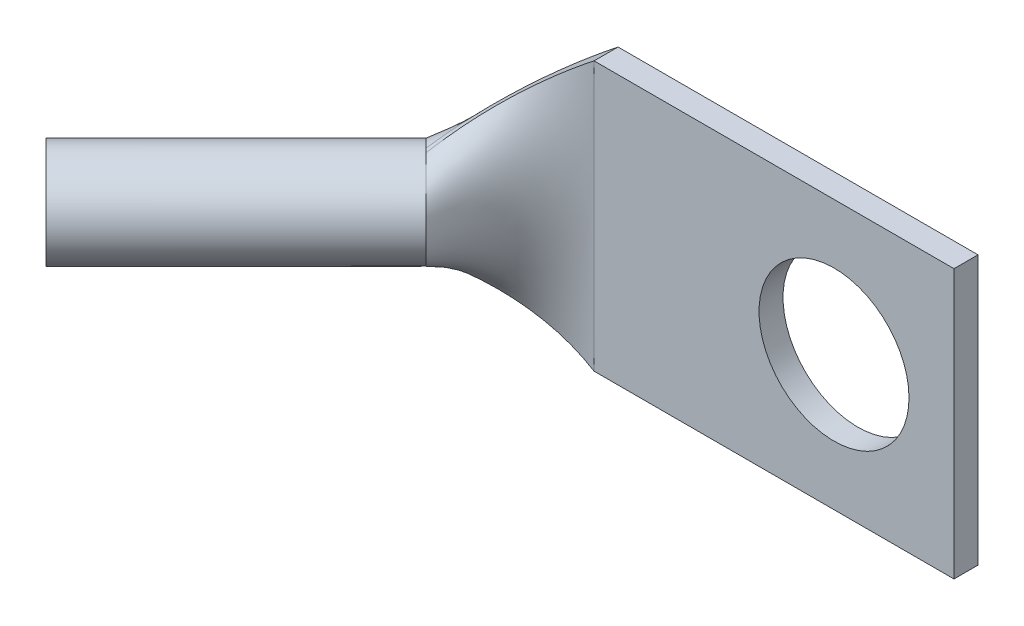
ISO-10303-21;
HEADER;
FILE_DESCRIPTION(('STEP AP214'),'2;1');
FILE_NAME('part.step','',(''),(''),'','','');
FILE_SCHEMA(('AUTOMOTIVE_DESIGN { 1 0 10303 214 1 1 1 1 }'));
ENDSEC;
DATA;
#1=APPLICATION_CONTEXT('core data for automotive mechanical design processes');
#2=APPLICATION_PROTOCOL_DEFINITION('international standard','automotive_design',2000,#1);
#3=PRODUCT_CONTEXT('',#1,'mechanical');
#4=PRODUCT('Part','Part','',(#3));
#5=PRODUCT_RELATED_PRODUCT_CATEGORY('part','',(#4));
#6=PRODUCT_DEFINITION_FORMATION('','',#4);
#7=PRODUCT_DEFINITION_CONTEXT('part definition',#1,'design');
#8=PRODUCT_DEFINITION('design','',#6,#7);
#9=PRODUCT_DEFINITION_SHAPE('','',#8);
#10=(LENGTH_UNIT() NAMED_UNIT(*) SI_UNIT(.MILLI.,.METRE.));
#11=(NAMED_UNIT(*) PLANE_ANGLE_UNIT() SI_UNIT($,.RADIAN.));
#12=(NAMED_UNIT(*) SI_UNIT($,.STERADIAN.) SOLID_ANGLE_UNIT());
#13=UNCERTAINTY_MEASURE_WITH_UNIT(LENGTH_MEASURE(1.E-05),#10,'distance_accuracy_value','');
#14=(GEOMETRIC_REPRESENTATION_CONTEXT(3) GLOBAL_UNCERTAINTY_ASSIGNED_CONTEXT((#13)) GLOBAL_UNIT_ASSIGNED_CONTEXT((#10,
#11,#12)) REPRESENTATION_CONTEXT('',''));
#15=CARTESIAN_POINT('',(0.,0.,0.));
#16=DIRECTION('',(0.,0.,1.));
#17=DIRECTION('',(1.,0.,0.));
#18=AXIS2_PLACEMENT_3D('',#15,#16,#17);
#19=CARTESIAN_POINT('',(-10.0578868555975,0.,10.0578868555975));
#20=DIRECTION('',(-0.707106781186547,0.,0.707106781186548));
#21=DIRECTION('',(0.707106781186548,0.,0.707106781186547));
#22=AXIS2_PLACEMENT_3D('',#19,#20,#21);
#23=PLANE('',#22);
#24=CARTESIAN_POINT('',(-10.0578868555975,0.,10.0578868555975));
#25=DIRECTION('',(-0.707106781186547,0.,0.707106781186548));
#26=DIRECTION('',(0.707106781186548,0.,0.707106781186547));
#27=AXIS2_PLACEMENT_3D('',#24,#25,#26);
#28=CIRCLE('',#27,2.4003);
#29=CARTESIAN_POINT('',(-8.36061844871538,0.,11.7551552624795));
#30=VERTEX_POINT('',#29);
#31=EDGE_CURVE('E140',#30,#30,#28,.T.);
#32=ORIENTED_EDGE('',*,*,#31,.T.);
#33=EDGE_LOOP('',(#32));
#34=FACE_BOUND('',#33,.T.);
#35=CARTESIAN_POINT('',(-10.0578868555975,0.,10.0578868555975));
#36=DIRECTION('',(-0.707106781186547,0.,0.707106781186548));
#37=DIRECTION('',(0.707106781186548,0.,0.707106781186547));
#38=AXIS2_PLACEMENT_3D('',#35,#36,#37);
#39=CIRCLE('',#38,1.6383);
#40=CARTESIAN_POINT('',(-8.89943381597953,0.,11.2163398952154));
#41=VERTEX_POINT('',#40);
#42=EDGE_CURVE('E217',#41,#41,#39,.T.);
#43=ORIENTED_EDGE('',*,*,#42,.F.);
#44=EDGE_LOOP('',(#43));
#45=FACE_BOUND('',#44,.T.);
#46=ADVANCED_FACE('F130',(#34,#45),#23,.T.);
#47=CARTESIAN_POINT('',(-10.0578868555975,0.,10.0578868555975));
#48=DIRECTION('',(0.707106781186547,0.,-0.707106781186548));
#49=DIRECTION('',(-0.707106781186548,0.,-0.707106781186547));
#50=AXIS2_PLACEMENT_3D('',#47,#48,#49);
#51=CYLINDRICAL_SURFACE('',#50,2.4003);
#52=ORIENTED_EDGE('',*,*,#31,.F.);
#53=EDGE_LOOP('',(#52));
#54=FACE_BOUND('',#53,.T.);
#55=CARTESIAN_POINT('',(-0.0856158656463956,2.39724423809908,-0.0856158656463956));
#56=CARTESIAN_POINT('',(-0.0678056900921732,2.39851639349581,-0.0678056900921731));
#57=CARTESIAN_POINT('',(-0.0321569828959637,2.40026672765528,-0.0321569828959637));
#58=CARTESIAN_POINT('',(0.0213480250002032,2.40050765508822,0.0213480250002032));
#59=CARTESIAN_POINT('',(0.0748318246908102,2.39836379705286,0.0748318246908102));
#60=CARTESIAN_POINT('',(0.110438129194003,2.39534610282651,0.110438129194003));
#61=CARTESIAN_POINT('',(0.128220048066058,2.39344089723308,0.128220048066058));
#62=B_SPLINE_CURVE_WITH_KNOTS('',3,(#55,#56,#57,#58,#59,#60,#61),.UNSPECIFIED.,.F.,.F.,(4,1,1,1,
4),(0.235738241616343,0.243369508765289,0.251000775914235,0.258632043063181,0.266263310212127),.UNSPECIFIED.);
#63=CARTESIAN_POINT('',(0.128225030543083,2.39353770867189,0.128225030543081));
#64=VERTEX_POINT('',#63);
#65=CARTESIAN_POINT('',(-0.0856170735877792,2.39727973056196,-0.0856170735877809));
#66=VERTEX_POINT('',#65);
#67=EDGE_CURVE('E207',#64,#66,#62,.F.);
#68=ORIENTED_EDGE('',*,*,#67,.T.);
#69=CARTESIAN_POINT('',(0.,0.,0.));
#70=DIRECTION('',(0.707106781186547,0.,-0.707106781186548));
#71=DIRECTION('',(0.707106781186548,0.,0.707106781186547));
#72=AXIS2_PLACEMENT_3D('',#69,#70,#71);
#73=CIRCLE('',#72,2.4003);
#74=CARTESIAN_POINT('',(-1.69726840688207,0.,-1.69726840688207));
#75=VERTEX_POINT('',#74);
#76=EDGE_CURVE('E190',#75,#66,#73,.T.);
#77=ORIENTED_EDGE('',*,*,#76,.F.);
#78=CARTESIAN_POINT('',(0.,0.,0.));
#79=DIRECTION('',(0.707106781186547,0.,-0.707106781186548));
#80=DIRECTION('',(0.707106781186548,0.,0.707106781186547));
#81=AXIS2_PLACEMENT_3D('',#78,#79,#80);
#82=CIRCLE('',#81,2.4003);
#83=CARTESIAN_POINT('',(-0.0856176831280756,-2.39729799351699,-0.085617683128079));
#84=VERTEX_POINT('',#83);
#85=EDGE_CURVE('E178',#84,#75,#82,.T.);
#86=ORIENTED_EDGE('',*,*,#85,.F.);
#87=CARTESIAN_POINT('',(0.,0.,0.));
#88=DIRECTION('',(0.707106781186547,0.,-0.707106781186548));
#89=DIRECTION('',(0.707106781186548,0.,0.707106781186547));
#90=AXIS2_PLACEMENT_3D('',#87,#88,#89);
#91=CIRCLE('',#90,2.4003);
#92=CARTESIAN_POINT('',(0.128223948791534,-2.39351661458043,0.128223948791532));
#93=VERTEX_POINT('',#92);
#94=EDGE_CURVE('E168',#93,#84,#91,.T.);
#95=ORIENTED_EDGE('',*,*,#94,.F.);
#96=CARTESIAN_POINT('',(0.,0.,0.));
#97=DIRECTION('',(-0.707106781186547,0.,0.707106781186548));
#98=DIRECTION('',(0.707106781186548,0.,0.707106781186547));
#99=AXIS2_PLACEMENT_3D('',#96,#97,#98);
#100=CIRCLE('',#99,2.4003);
#101=EDGE_CURVE('E200',#64,#93,#100,.F.);
#102=ORIENTED_EDGE('',*,*,#101,.F.);
#103=EDGE_LOOP('',(#68,#77,#86,#95,#102));
#104=FACE_BOUND('',#103,.T.);
#105=ADVANCED_FACE('F132',(#54,#104),#51,.T.);
#106=CARTESIAN_POINT('',(-10.0578868555975,0.,10.0578868555975));
#107=DIRECTION('',(0.707106781186547,0.,-0.707106781186548));
#108=DIRECTION('',(-0.707106781186548,0.,-0.707106781186547));
#109=AXIS2_PLACEMENT_3D('',#106,#107,#108);
#110=CYLINDRICAL_SURFACE('',#109,1.6383);
#111=CARTESIAN_POINT('',(-0.898025612106914,0.,0.898025612106916));
#112=DIRECTION('',(-0.707106781186547,0.,0.707106781186548));
#113=DIRECTION('',(0.707106781186548,0.,0.707106781186547));
#114=AXIS2_PLACEMENT_3D('',#111,#112,#113);
#115=CIRCLE('',#114,1.6383);
#116=CARTESIAN_POINT('',(0.260427427511007,0.,2.05647865172484));
#117=VERTEX_POINT('',#116);
#118=EDGE_CURVE('E13',#117,#117,#115,.T.);
#119=ORIENTED_EDGE('',*,*,#118,.F.);
#120=EDGE_LOOP('',(#119));
#121=FACE_BOUND('',#120,.T.);
#122=ORIENTED_EDGE('',*,*,#42,.T.);
#123=EDGE_LOOP('',(#122));
#124=FACE_BOUND('',#123,.T.);
#125=ADVANCED_FACE('F510',(#121,#124),#110,.F.);
#126=CARTESIAN_POINT('',(-0.898025612106915,0.,0.898025612106916));
#127=DIRECTION('',(-0.707106781186547,0.,0.707106781186548));
#128=DIRECTION('',(0.707106781186548,0.,0.707106781186547));
#129=AXIS2_PLACEMENT_3D('',#126,#127,#128);
#130=PLANE('',#129);
#131=ORIENTED_EDGE('',*,*,#118,.T.);
#132=EDGE_LOOP('',(#131));
#133=FACE_BOUND('',#132,.T.);
#134=ADVANCED_FACE('F516',(#133),#130,.T.);
#135=CARTESIAN_POINT('',(-0.0856158656463964,-2.39724423809908,-0.0856158656463964));
#136=CARTESIAN_POINT('',(0.979057117819121,-3.96882949206605,-2.75249603339793));
#137=CARTESIAN_POINT('',(2.95235050300656,-5.54041474603303,-4.54278248625477));
#138=CARTESIAN_POINT('',(5.08,-7.112,-5.08));
#139=CARTESIAN_POINT('',(-0.291524054424608,-2.38253651032921,-0.291524054424608));
#140=CARTESIAN_POINT('',(0.84178499196698,-3.75288358223842,-2.88976815925007));
#141=CARTESIAN_POINT('',(2.88371444008048,-5.12323065414763,-4.61141854918084));
#142=CARTESIAN_POINT('',(5.08,-6.49357772605684,-5.08));
#143=CARTESIAN_POINT('',(-0.708127054574494,-2.24488382370541,-0.708127054574494));
#144=CARTESIAN_POINT('',(0.564049658533723,-3.25805793213934,-3.16750349268333));
#145=CARTESIAN_POINT('',(2.74484677336386,-4.27123204057326,-4.75028621589748));
#146=CARTESIAN_POINT('',(5.08,-5.28440614900718,-5.08));
#147=CARTESIAN_POINT('',(-1.25001698929095,-1.71146269681553,-1.25001698929095));
#148=CARTESIAN_POINT('',(0.202789702056086,-2.3131398477975,-3.52876344916096));
#149=CARTESIAN_POINT('',(2.56421679512504,-2.91481699877946,-4.93091619413629));
#150=CARTESIAN_POINT('',(5.08,-3.51649414976143,-5.08));
#151=CARTESIAN_POINT('',(-1.61419068475015,-0.919150779493687,-1.61419068475015));
#152=CARTESIAN_POINT('',(-0.0399927615833843,-1.20136343462941,-3.77154591280044));
#153=CARTESIAN_POINT('',(2.4428255633053,-1.48357608976513,-5.05230742595603));
#154=CARTESIAN_POINT('',(5.08,-1.76578874490084,-5.08));
#155=CARTESIAN_POINT('',(-1.69726840688207,-0.304104322580167,-1.69726840688207));
#156=CARTESIAN_POINT('',(-0.0953779096713275,-0.400291770609001,-3.82693106088838));
#157=CARTESIAN_POINT('',(2.41513298926133,-0.496479218637834,-5.08));
#158=CARTESIAN_POINT('',(5.08,-0.592666666666667,-5.08));
#159=CARTESIAN_POINT('',(-1.69726840688207,0.,-1.69726840688207));
#160=CARTESIAN_POINT('',(-0.0953779096713276,0.,-3.82693106088838));
#161=CARTESIAN_POINT('',(2.41513298926133,0.,-5.08));
#162=CARTESIAN_POINT('',(5.08,0.,-5.08));
#163=B_SPLINE_SURFACE_WITH_KNOTS('',3,3,((#135,#136,#137,#138),(#139,#140,#141,#142),(#143,#144,
#145,#146),(#147,#148,#149,#150),(#151,#152,#153,#154),(#155,#156,#157,#158),(#159,#160,#161,
#162)),.UNSPECIFIED.,.F.,.F.,.F.,(4,1,1,1,4),(4,4),(0.764261758383657,0.823196318787742,
0.882130879191828,0.941065439595914,1.),(0.,1.),.UNSPECIFIED.);
#164=CARTESIAN_POINT('',(-1.69726840688207,0.,-1.69726840688207));
#165=CARTESIAN_POINT('',(-0.0953779096713276,0.,-3.82693106088838));
#166=CARTESIAN_POINT('',(2.41513298926133,0.,-5.08));
#167=CARTESIAN_POINT('',(5.08,0.,-5.08));
#168=B_SPLINE_CURVE_WITH_KNOTS('',3,(#164,#165,#166,#167),.UNSPECIFIED.,.F.,.F.,(4,4),(0.,1.),.UNSPECIFIED.);
#169=CARTESIAN_POINT('',(5.08,0.,-5.08));
#170=VERTEX_POINT('',#169);
#171=EDGE_CURVE('E196',#75,#170,#168,.T.);
#172=DIRECTION('',(0.,1.,0.));
#173=VECTOR('',#172,1.);
#174=CARTESIAN_POINT('',(5.08,-7.112,-5.08));
#175=LINE('',#174,#173);
#176=CARTESIAN_POINT('',(5.08,-7.112,-5.08));
#177=VERTEX_POINT('',#176);
#178=EDGE_CURVE('E463',#177,#170,#175,.T.);
#179=CARTESIAN_POINT('',(-0.0856158656463964,-2.39724423809908,-0.0856158656463964));
#180=CARTESIAN_POINT('',(0.979057117819121,-3.96882949206605,-2.75249603339793));
#181=CARTESIAN_POINT('',(2.95235050300656,-5.54041474603303,-4.54278248625477));
#182=CARTESIAN_POINT('',(5.08,-7.112,-5.08));
#183=B_SPLINE_CURVE_WITH_KNOTS('',3,(#179,#180,#181,#182),.UNSPECIFIED.,.F.,.F.,(4,4),(0.,1.),.UNSPECIFIED.);
#184=EDGE_CURVE('E289',#84,#177,#183,.T.);
#185=ORIENTED_EDGE('',*,*,#85,.T.);
#186=ORIENTED_EDGE('',*,*,#171,.T.);
#187=ORIENTED_EDGE('',*,*,#178,.F.);
#188=ORIENTED_EDGE('',*,*,#184,.F.);
#189=EDGE_LOOP('',(#185,#186,#187,#188));
#190=FACE_BOUND('',#189,.T.);
#191=ADVANCED_FACE('F265',(#190),#163,.T.);
#192=CARTESIAN_POINT('',(0.128220048066058,-2.39344089723308,0.128220048066058));
#193=CARTESIAN_POINT('',(1.12161439362742,-3.96629393148872,-2.18660542425629));
#194=CARTESIAN_POINT('',(3.02362914091071,-5.53914696574436,-3.62483718168395));
#195=CARTESIAN_POINT('',(5.08,-7.112,-3.81));
#196=CARTESIAN_POINT('',(0.110438129194003,-2.39534610282651,0.110438129194003));
#197=CARTESIAN_POINT('',(1.10975978104605,-3.96756406855101,-2.23373781461544));
#198=CARTESIAN_POINT('',(3.01770183462002,-5.5397820342755,-3.7013200435302));
#199=CARTESIAN_POINT('',(5.08,-7.112,-3.91583333333333));
#200=CARTESIAN_POINT('',(0.0748318246908103,-2.39836379705286,0.0748318246908103));
#201=CARTESIAN_POINT('',(1.0860222447106,-3.96957586470191,-2.32803090650646));
#202=CARTESIAN_POINT('',(3.0058330664523,-5.54078793235095,-3.85429992280904));
#203=CARTESIAN_POINT('',(5.08000000000001,-7.11199999999999,-4.1275));
#204=CARTESIAN_POINT('',(0.0213480250002031,-2.40050765508823,0.021348025000203));
#205=CARTESIAN_POINT('',(1.05036637825018,-3.97100510339215,-2.4695201063002));
#206=CARTESIAN_POINT('',(2.98800513322208,-5.54150255169608,-4.0837945227059));
#207=CARTESIAN_POINT('',(5.07999999999999,-7.11200000000001,-4.445));
#208=CARTESIAN_POINT('',(-0.032156982895964,-2.40026672765528,-0.032156982895964));
#209=CARTESIAN_POINT('',(1.01469637298608,-3.97084448510352,-2.61102344489764));
#210=CARTESIAN_POINT('',(2.97017013059004,-5.54142224255176,-4.31329619200463));
#211=CARTESIAN_POINT('',(5.08000000000001,-7.112,-4.7625));
#212=CARTESIAN_POINT('',(-0.0678056900921737,-2.39851639349581,-0.0678056900921737));
#213=CARTESIAN_POINT('',(0.990930568188603,-3.96967759566387,-2.70534480525067));
#214=CARTESIAN_POINT('',(2.9582872281913,-5.54083879783194,-4.46629020551448));
#215=CARTESIAN_POINT('',(5.08,-7.112,-4.97416666666667));
#216=CARTESIAN_POINT('',(-0.0856158656463964,-2.39724423809908,-0.0856158656463964));
#217=CARTESIAN_POINT('',(0.979057117819121,-3.96882949206605,-2.75249603339793));
#218=CARTESIAN_POINT('',(2.95235050300656,-5.54041474603303,-4.54278248625477));
#219=CARTESIAN_POINT('',(5.08,-7.112,-5.08));
#220=B_SPLINE_SURFACE_WITH_KNOTS('',3,3,((#192,#193,#194,#195),(#196,#197,#198,#199),(#200,#201,
#202,#203),(#204,#205,#206,#207),(#208,#209,#210,#211),(#212,#213,#214,#215),(#216,#217,#218,
#219)),.UNSPECIFIED.,.F.,.F.,.F.,(4,1,1,1,4),(4,4),(0.733736689787873,0.741367956936819,
0.748999224085765,0.756630491234711,0.764261758383657),(0.,1.),.UNSPECIFIED.);
#221=DIRECTION('',(0.,0.,-1.));
#222=VECTOR('',#221,1.);
#223=CARTESIAN_POINT('',(5.08,-7.112,-5.08));
#224=LINE('',#223,#222);
#225=CARTESIAN_POINT('',(5.08,-7.112,-3.81));
#226=VERTEX_POINT('',#225);
#227=EDGE_CURVE('E201',#226,#177,#224,.T.);
#228=CARTESIAN_POINT('',(0.128220048066058,-2.39344089723308,0.128220048066058));
#229=CARTESIAN_POINT('',(1.12161439362742,-3.96629393148872,-2.18660542425629));
#230=CARTESIAN_POINT('',(3.02362914091071,-5.53914696574436,-3.62483718168395));
#231=CARTESIAN_POINT('',(5.08,-7.112,-3.81));
#232=B_SPLINE_CURVE_WITH_KNOTS('',3,(#228,#229,#230,#231),.UNSPECIFIED.,.F.,.F.,(4,4),(0.,1.),.UNSPECIFIED.);
#233=EDGE_CURVE('E148',#93,#226,#232,.T.);
#234=ORIENTED_EDGE('',*,*,#94,.T.);
#235=ORIENTED_EDGE('',*,*,#184,.T.);
#236=ORIENTED_EDGE('',*,*,#227,.F.);
#237=ORIENTED_EDGE('',*,*,#233,.F.);
#238=EDGE_LOOP('',(#234,#235,#236,#237));
#239=FACE_BOUND('',#238,.T.);
#240=ADVANCED_FACE('F252',(#239),#220,.T.);
#241=CARTESIAN_POINT('',(0.128220048066058,2.39344089723308,0.128220048066058));
#242=CARTESIAN_POINT('',(1.12161439362742,3.96629393148872,-2.18660542425629));
#243=CARTESIAN_POINT('',(3.02362914091071,5.53914696574436,-3.62483718168395));
#244=CARTESIAN_POINT('',(5.08,7.112,-3.81));
#245=CARTESIAN_POINT('',(0.339092451547004,2.37084742543155,0.339092451547004));
#246=CARTESIAN_POINT('',(1.26219599594805,3.75367606139881,-2.04602382193566));
#247=CARTESIAN_POINT('',(3.09391994207102,5.13650469736607,-3.55454638052364));
#248=CARTESIAN_POINT('',(5.08,6.51933333333333,-3.81));
#249=CARTESIAN_POINT('',(0.754732902327056,2.21301722501273,0.754732902327055));
#250=CARTESIAN_POINT('',(1.53928962980142,3.25334481667515,-1.7689301880823));
#251=CARTESIAN_POINT('',(3.23246675899771,4.29367240833758,-3.41599956359696));
#252=CARTESIAN_POINT('',(5.08,5.334,-3.81));
#253=CARTESIAN_POINT('',(1.27404356876115,1.67033177946393,1.27404356876116));
#254=CARTESIAN_POINT('',(1.88549674075749,2.29888785297595,-1.42272307712623));
#255=CARTESIAN_POINT('',(3.40557031447574,2.92744392648798,-3.24289600811892));
#256=CARTESIAN_POINT('',(5.08,3.556,-3.81));
#257=CARTESIAN_POINT('',(1.61733689746755,0.897145645963959,1.61733689746754));
#258=CARTESIAN_POINT('',(2.11435895989508,1.19076376397597,-1.19386085798864));
#259=CARTESIAN_POINT('',(3.52000142404454,1.48438188198798,-3.12846489855013));
#260=CARTESIAN_POINT('',(5.08,1.778,-3.81));
#261=CARTESIAN_POINT('',(1.73730713695146,0.,1.73730713695146));
#262=CARTESIAN_POINT('',(2.19433911955102,0.,-1.11388069833269));
#263=CARTESIAN_POINT('',(3.55999150387251,0.,-3.08847481872215));
#264=CARTESIAN_POINT('',(5.08,0.,-3.81));
#265=CARTESIAN_POINT('',(1.61733689746754,-0.897145645963958,1.61733689746754));
#266=CARTESIAN_POINT('',(2.11435895989508,-1.19076376397597,-1.19386085798864));
#267=CARTESIAN_POINT('',(3.52000142404453,-1.48438188198799,-3.12846489855013));
#268=CARTESIAN_POINT('',(5.08,-1.778,-3.81));
#269=CARTESIAN_POINT('',(1.27404356876116,-1.67033177946393,1.27404356876116));
#270=CARTESIAN_POINT('',(1.88549674075749,-2.29888785297596,-1.42272307712623));
#271=CARTESIAN_POINT('',(3.40557031447574,-2.92744392648798,-3.24289600811892));
#272=CARTESIAN_POINT('',(5.08,-3.556,-3.81));
#273=CARTESIAN_POINT('',(0.754732902327054,-2.21301722501273,0.754732902327053));
#274=CARTESIAN_POINT('',(1.53928962980142,-3.25334481667515,-1.7689301880823));
#275=CARTESIAN_POINT('',(3.23246675899771,-4.29367240833758,-3.41599956359696));
#276=CARTESIAN_POINT('',(5.08,-5.334,-3.81));
#277=CARTESIAN_POINT('',(0.339092451547004,-2.37084742543155,0.339092451547004));
#278=CARTESIAN_POINT('',(1.26219599594805,-3.75367606139881,-2.04602382193566));
#279=CARTESIAN_POINT('',(3.09391994207102,-5.13650469736607,-3.55454638052364));
#280=CARTESIAN_POINT('',(5.08,-6.51933333333334,-3.81));
#281=CARTESIAN_POINT('',(0.128220048066058,-2.39344089723308,0.128220048066058));
#282=CARTESIAN_POINT('',(1.12161439362742,-3.96629393148872,-2.18660542425629));
#283=CARTESIAN_POINT('',(3.02362914091071,-5.53914696574436,-3.62483718168395));
#284=CARTESIAN_POINT('',(5.08,-7.112,-3.81));
#285=B_SPLINE_SURFACE_WITH_KNOTS('',3,3,((#241,#242,#243,#244),(#245,#246,#247,#248),(#249,#250,
#251,#252),(#253,#254,#255,#256),(#257,#258,#259,#260),(#261,#262,#263,#264),(#265,#266,#267,
#268),(#269,#270,#271,#272),(#273,#274,#275,#276),(#277,#278,#279,#280),(#281,#282,#283,#284)),
.UNSPECIFIED.,.F.,.F.,.F.,(4,1,1,1,1,1,1,1,4),(4,4),(0.266263310212127,0.324697482659095,
0.383131655106063,0.441565827553032,0.5,0.558434172446968,0.616868344893937,0.675302517340905,
0.733736689787873),(0.,1.),.UNSPECIFIED.);
#286=DIRECTION('',(0.,-1.,0.));
#287=VECTOR('',#286,1.);
#288=CARTESIAN_POINT('',(5.08,-7.112,-3.81));
#289=LINE('',#288,#287);
#290=CARTESIAN_POINT('',(5.08,7.112,-3.81));
#291=VERTEX_POINT('',#290);
#292=EDGE_CURVE('E156',#291,#226,#289,.T.);
#293=CARTESIAN_POINT('',(0.128220048066058,2.39344089723308,0.128220048066058));
#294=CARTESIAN_POINT('',(1.12161439362742,3.96629393148872,-2.18660542425629));
#295=CARTESIAN_POINT('',(3.02362914091071,5.53914696574436,-3.62483718168395));
#296=CARTESIAN_POINT('',(5.08,7.112,-3.81));
#297=B_SPLINE_CURVE_WITH_KNOTS('',3,(#293,#294,#295,#296),.UNSPECIFIED.,.F.,.F.,(4,4),(0.,1.),.UNSPECIFIED.);
#298=EDGE_CURVE('E212',#64,#291,#297,.T.);
#299=ORIENTED_EDGE('',*,*,#101,.T.);
#300=ORIENTED_EDGE('',*,*,#233,.T.);
#301=ORIENTED_EDGE('',*,*,#292,.F.);
#302=ORIENTED_EDGE('',*,*,#298,.F.);
#303=EDGE_LOOP('',(#299,#300,#301,#302));
#304=FACE_BOUND('',#303,.T.);
#305=ADVANCED_FACE('F264',(#304),#285,.T.);
#306=CARTESIAN_POINT('',(-0.0856158656463956,2.39724423809908,-0.0856158656463956));
#307=CARTESIAN_POINT('',(0.979057117819122,3.96882949206605,-2.75249603339793));
#308=CARTESIAN_POINT('',(2.95235050300656,5.54041474603303,-4.54278248625477));
#309=CARTESIAN_POINT('',(5.08,7.112,-5.08));
#310=CARTESIAN_POINT('',(-0.0678056900921732,2.39851639349581,-0.0678056900921731));
#311=CARTESIAN_POINT('',(0.990930568188603,3.96967759566387,-2.70534480525067));
#312=CARTESIAN_POINT('',(2.9582872281913,5.54083879783194,-4.46629020551447));
#313=CARTESIAN_POINT('',(5.08,7.112,-4.97416666666667));
#314=CARTESIAN_POINT('',(-0.0321569828959637,2.40026672765528,-0.0321569828959637));
#315=CARTESIAN_POINT('',(1.01469637298608,3.97084448510352,-2.61102344489764));
#316=CARTESIAN_POINT('',(2.97017013059003,5.54142224255175,-4.31329619200462));
#317=CARTESIAN_POINT('',(5.08,7.11199999999999,-4.76249999999999));
#318=CARTESIAN_POINT('',(0.0213480250002032,2.40050765508822,0.0213480250002032));
#319=CARTESIAN_POINT('',(1.05036637825019,3.97100510339215,-2.4695201063002));
#320=CARTESIAN_POINT('',(2.98800513322209,5.54150255169609,-4.08379452270591));
#321=CARTESIAN_POINT('',(5.08,7.11200000000002,-4.445));
#322=CARTESIAN_POINT('',(0.0748318246908102,2.39836379705286,0.0748318246908102));
#323=CARTESIAN_POINT('',(1.08602224471059,3.96957586470191,-2.32803090650646));
#324=CARTESIAN_POINT('',(3.00583306645229,5.54078793235095,-3.85429992280904));
#325=CARTESIAN_POINT('',(5.08,7.11199999999999,-4.1275));
#326=CARTESIAN_POINT('',(0.110438129194003,2.39534610282651,0.110438129194003));
#327=CARTESIAN_POINT('',(1.10975978104605,3.96756406855101,-2.23373781461544));
#328=CARTESIAN_POINT('',(3.01770183462002,5.5397820342755,-3.70132004353019));
#329=CARTESIAN_POINT('',(5.08,7.112,-3.91583333333333));
#330=CARTESIAN_POINT('',(0.128220048066058,2.39344089723308,0.128220048066058));
#331=CARTESIAN_POINT('',(1.12161439362742,3.96629393148872,-2.18660542425629));
#332=CARTESIAN_POINT('',(3.02362914091071,5.53914696574436,-3.62483718168395));
#333=CARTESIAN_POINT('',(5.08,7.112,-3.81));
#334=B_SPLINE_SURFACE_WITH_KNOTS('',3,3,((#306,#307,#308,#309),(#310,#311,#312,#313),(#314,#315,
#316,#317),(#318,#319,#320,#321),(#322,#323,#324,#325),(#326,#327,#328,#329),(#330,#331,#332,
#333)),.UNSPECIFIED.,.F.,.F.,.F.,(4,1,1,1,4),(4,4),(0.235738241616343,0.243369508765289,
0.251000775914235,0.258632043063181,0.266263310212127),(0.,1.),.UNSPECIFIED.);
#335=DIRECTION('',(0.,0.,1.));
#336=VECTOR('',#335,1.);
#337=CARTESIAN_POINT('',(5.08,7.112,-5.08));
#338=LINE('',#337,#336);
#339=CARTESIAN_POINT('',(5.08,7.112,-5.08));
#340=VERTEX_POINT('',#339);
#341=EDGE_CURVE('E210',#340,#291,#338,.T.);
#342=CARTESIAN_POINT('',(-0.0856158656463956,2.39724423809908,-0.0856158656463956));
#343=CARTESIAN_POINT('',(0.979057117819122,3.96882949206605,-2.75249603339793));
#344=CARTESIAN_POINT('',(2.95235050300656,5.54041474603303,-4.54278248625477));
#345=CARTESIAN_POINT('',(5.08,7.112,-5.08));
#346=B_SPLINE_CURVE_WITH_KNOTS('',3,(#342,#343,#344,#345),.UNSPECIFIED.,.F.,.F.,(4,4),(0.,1.),.UNSPECIFIED.);
#347=EDGE_CURVE('E194',#66,#340,#346,.T.);
#348=ORIENTED_EDGE('',*,*,#67,.F.);
#349=ORIENTED_EDGE('',*,*,#298,.T.);
#350=ORIENTED_EDGE('',*,*,#341,.F.);
#351=ORIENTED_EDGE('',*,*,#347,.F.);
#352=EDGE_LOOP('',(#348,#349,#350,#351));
#353=FACE_BOUND('',#352,.T.);
#354=ADVANCED_FACE('F206',(#353),#334,.T.);
#355=CARTESIAN_POINT('',(-1.69726840688207,0.,-1.69726840688207));
#356=CARTESIAN_POINT('',(-0.0953779096713276,0.,-3.82693106088838));
#357=CARTESIAN_POINT('',(2.41513298926133,0.,-5.08));
#358=CARTESIAN_POINT('',(5.08,0.,-5.08));
#359=CARTESIAN_POINT('',(-1.69726840688207,0.304104322580168,-1.69726840688207));
#360=CARTESIAN_POINT('',(-0.0953779096713278,0.400291770609,-3.82693106088838));
#361=CARTESIAN_POINT('',(2.41513298926133,0.496479218637833,-5.08));
#362=CARTESIAN_POINT('',(5.08,0.592666666666667,-5.08));
#363=CARTESIAN_POINT('',(-1.61419068475015,0.919150779493688,-1.61419068475015));
#364=CARTESIAN_POINT('',(-0.0399927615833876,1.20136343462941,-3.77154591280043));
#365=CARTESIAN_POINT('',(2.4428255633053,1.48357608976512,-5.05230742595602));
#366=CARTESIAN_POINT('',(5.07999999999999,1.76578874490084,-5.07999999999999));
#367=CARTESIAN_POINT('',(-1.25001698929095,1.71146269681553,-1.25001698929095));
#368=CARTESIAN_POINT('',(0.202789702056089,2.3131398477975,-3.52876344916097));
#369=CARTESIAN_POINT('',(2.56421679512504,2.91481699877946,-4.93091619413629));
#370=CARTESIAN_POINT('',(5.08000000000001,3.51649414976143,-5.08));
#371=CARTESIAN_POINT('',(-0.708127054574493,2.24488382370541,-0.708127054574493));
#372=CARTESIAN_POINT('',(0.564049658533721,3.25805793213933,-3.16750349268333));
#373=CARTESIAN_POINT('',(2.74484677336385,4.27123204057326,-4.75028621589747));
#374=CARTESIAN_POINT('',(5.07999999999999,5.28440614900718,-5.07999999999999));
#375=CARTESIAN_POINT('',(-0.291524054424607,2.38253651032921,-0.291524054424607));
#376=CARTESIAN_POINT('',(0.841784991966981,3.75288358223842,-2.88976815925007));
#377=CARTESIAN_POINT('',(2.88371444008048,5.12323065414763,-4.61141854918084));
#378=CARTESIAN_POINT('',(5.08,6.49357772605684,-5.08));
#379=CARTESIAN_POINT('',(-0.0856158656463956,2.39724423809908,-0.0856158656463956));
#380=CARTESIAN_POINT('',(0.979057117819122,3.96882949206605,-2.75249603339793));
#381=CARTESIAN_POINT('',(2.95235050300656,5.54041474603303,-4.54278248625477));
#382=CARTESIAN_POINT('',(5.08,7.112,-5.08));
#383=B_SPLINE_SURFACE_WITH_KNOTS('',3,3,((#355,#356,#357,#358),(#359,#360,#361,#362),(#363,#364,
#365,#366),(#367,#368,#369,#370),(#371,#372,#373,#374),(#375,#376,#377,#378),(#379,#380,#381,
#382)),.UNSPECIFIED.,.F.,.F.,.F.,(4,1,1,1,4),(4,4),(0.,0.0589345604040858,0.117869120808172,
0.176803681212257,0.235738241616343),(0.,1.),.UNSPECIFIED.);
#384=EDGE_CURVE('E466',#170,#340,#175,.T.);
#385=ORIENTED_EDGE('',*,*,#76,.T.);
#386=ORIENTED_EDGE('',*,*,#347,.T.);
#387=ORIENTED_EDGE('',*,*,#384,.F.);
#388=ORIENTED_EDGE('',*,*,#171,.F.);
#389=EDGE_LOOP('',(#385,#386,#387,#388));
#390=FACE_BOUND('',#389,.T.);
#391=ADVANCED_FACE('F193',(#390),#383,.T.);
#392=CARTESIAN_POINT('',(24.13,-7.112,-5.08));
#393=DIRECTION('',(0.,0.,1.));
#394=DIRECTION('',(1.,0.,0.));
#395=AXIS2_PLACEMENT_3D('',#392,#393,#394);
#396=PLANE('',#395);
#397=CARTESIAN_POINT('',(17.78,0.,-5.08));
#398=DIRECTION('',(0.,0.,1.));
#399=DIRECTION('',(1.,0.,0.));
#400=AXIS2_PLACEMENT_3D('',#397,#398,#399);
#401=CIRCLE('',#400,3.96875);
#402=CARTESIAN_POINT('',(21.74875,0.,-5.08));
#403=VERTEX_POINT('',#402);
#404=EDGE_CURVE('E135',#403,#403,#401,.T.);
#405=ORIENTED_EDGE('',*,*,#404,.T.);
#406=EDGE_LOOP('',(#405));
#407=FACE_BOUND('',#406,.T.);
#408=ORIENTED_EDGE('',*,*,#178,.T.);
#409=ORIENTED_EDGE('',*,*,#384,.T.);
#410=DIRECTION('',(-1.,0.,0.));
#411=VECTOR('',#410,1.);
#412=CARTESIAN_POINT('',(24.13,7.112,-5.08));
#413=LINE('',#412,#411);
#414=CARTESIAN_POINT('',(24.13,7.112,-5.08));
#415=VERTEX_POINT('',#414);
#416=EDGE_CURVE('E388',#415,#340,#413,.T.);
#417=ORIENTED_EDGE('',*,*,#416,.F.);
#418=DIRECTION('',(0.,1.,0.));
#419=VECTOR('',#418,1.);
#420=CARTESIAN_POINT('',(24.13,-7.112,-5.08));
#421=LINE('',#420,#419);
#422=CARTESIAN_POINT('',(24.13,-7.112,-5.08));
#423=VERTEX_POINT('',#422);
#424=EDGE_CURVE('E489',#423,#415,#421,.T.);
#425=ORIENTED_EDGE('',*,*,#424,.F.);
#426=DIRECTION('',(-1.,0.,0.));
#427=VECTOR('',#426,1.);
#428=CARTESIAN_POINT('',(24.13,-7.112,-5.08));
#429=LINE('',#428,#427);
#430=EDGE_CURVE('E434',#423,#177,#429,.T.);
#431=ORIENTED_EDGE('',*,*,#430,.T.);
#432=EDGE_LOOP('',(#408,#409,#417,#425,#431));
#433=FACE_BOUND('',#432,.T.);
#434=ADVANCED_FACE('F351',(#407,#433),#396,.F.);
#435=CARTESIAN_POINT('',(24.13,7.112,-5.08));
#436=DIRECTION('',(0.,-1.,0.));
#437=DIRECTION('',(0.,0.,-1.));
#438=AXIS2_PLACEMENT_3D('',#435,#436,#437);
#439=PLANE('',#438);
#440=ORIENTED_EDGE('',*,*,#341,.T.);
#441=DIRECTION('',(-1.,0.,0.));
#442=VECTOR('',#441,1.);
#443=CARTESIAN_POINT('',(24.13,7.112,-3.81));
#444=LINE('',#443,#442);
#445=CARTESIAN_POINT('',(24.13,7.112,-3.81));
#446=VERTEX_POINT('',#445);
#447=EDGE_CURVE('E385',#446,#291,#444,.T.);
#448=ORIENTED_EDGE('',*,*,#447,.F.);
#449=DIRECTION('',(0.,0.,1.));
#450=VECTOR('',#449,1.);
#451=CARTESIAN_POINT('',(24.13,7.112,-5.08));
#452=LINE('',#451,#450);
#453=EDGE_CURVE('E456',#415,#446,#452,.T.);
#454=ORIENTED_EDGE('',*,*,#453,.F.);
#455=ORIENTED_EDGE('',*,*,#416,.T.);
#456=EDGE_LOOP('',(#440,#448,#454,#455));
#457=FACE_BOUND('',#456,.T.);
#458=ADVANCED_FACE('F400',(#457),#439,.F.);
#459=CARTESIAN_POINT('',(24.13,-7.112,-3.81));
#460=DIRECTION('',(0.,0.,-1.));
#461=DIRECTION('',(0.,1.,0.));
#462=AXIS2_PLACEMENT_3D('',#459,#460,#461);
#463=PLANE('',#462);
#464=CARTESIAN_POINT('',(17.78,0.,-3.81));
#465=DIRECTION('',(0.,0.,1.));
#466=DIRECTION('',(1.,0.,0.));
#467=AXIS2_PLACEMENT_3D('',#464,#465,#466);
#468=CIRCLE('',#467,3.96875);
#469=CARTESIAN_POINT('',(21.74875,0.,-3.81));
#470=VERTEX_POINT('',#469);
#471=EDGE_CURVE('E492',#470,#470,#468,.T.);
#472=ORIENTED_EDGE('',*,*,#471,.F.);
#473=EDGE_LOOP('',(#472));
#474=FACE_BOUND('',#473,.T.);
#475=ORIENTED_EDGE('',*,*,#292,.T.);
#476=DIRECTION('',(-1.,0.,0.));
#477=VECTOR('',#476,1.);
#478=CARTESIAN_POINT('',(24.13,-7.112,-3.81));
#479=LINE('',#478,#477);
#480=CARTESIAN_POINT('',(24.13,-7.112,-3.81));
#481=VERTEX_POINT('',#480);
#482=EDGE_CURVE('E389',#481,#226,#479,.T.);
#483=ORIENTED_EDGE('',*,*,#482,.F.);
#484=DIRECTION('',(0.,-1.,0.));
#485=VECTOR('',#484,1.);
#486=CARTESIAN_POINT('',(24.13,-7.112,-3.81));
#487=LINE('',#486,#485);
#488=EDGE_CURVE('E453',#446,#481,#487,.T.);
#489=ORIENTED_EDGE('',*,*,#488,.F.);
#490=ORIENTED_EDGE('',*,*,#447,.T.);
#491=EDGE_LOOP('',(#475,#483,#489,#490));
#492=FACE_BOUND('',#491,.T.);
#493=ADVANCED_FACE('F408',(#474,#492),#463,.F.);
#494=CARTESIAN_POINT('',(24.13,-7.112,-5.08));
#495=DIRECTION('',(0.,1.,0.));
#496=DIRECTION('',(0.,0.,1.));
#497=AXIS2_PLACEMENT_3D('',#494,#495,#496);
#498=PLANE('',#497);
#499=ORIENTED_EDGE('',*,*,#227,.T.);
#500=ORIENTED_EDGE('',*,*,#430,.F.);
#501=DIRECTION('',(0.,0.,-1.));
#502=VECTOR('',#501,1.);
#503=CARTESIAN_POINT('',(24.13,-7.112,-5.08));
#504=LINE('',#503,#502);
#505=EDGE_CURVE('E446',#481,#423,#504,.T.);
#506=ORIENTED_EDGE('',*,*,#505,.F.);
#507=ORIENTED_EDGE('',*,*,#482,.T.);
#508=EDGE_LOOP('',(#499,#500,#506,#507));
#509=FACE_BOUND('',#508,.T.);
#510=ADVANCED_FACE('F412',(#509),#498,.F.);
#511=CARTESIAN_POINT('',(24.13,0.,0.));
#512=DIRECTION('',(1.,0.,0.));
#513=DIRECTION('',(0.,0.,-1.));
#514=AXIS2_PLACEMENT_3D('',#511,#512,#513);
#515=PLANE('',#514);
#516=ORIENTED_EDGE('',*,*,#424,.T.);
#517=ORIENTED_EDGE('',*,*,#453,.T.);
#518=ORIENTED_EDGE('',*,*,#488,.T.);
#519=ORIENTED_EDGE('',*,*,#505,.T.);
#520=EDGE_LOOP('',(#516,#517,#518,#519));
#521=FACE_BOUND('',#520,.T.);
#522=ADVANCED_FACE('F417',(#521),#515,.T.);
#523=CARTESIAN_POINT('',(17.78,0.,-3.81));
#524=DIRECTION('',(0.,0.,1.));
#525=DIRECTION('',(1.,0.,0.));
#526=AXIS2_PLACEMENT_3D('',#523,#524,#525);
#527=CYLINDRICAL_SURFACE('',#526,3.96875);
#528=ORIENTED_EDGE('',*,*,#471,.T.);
#529=EDGE_LOOP('',(#528));
#530=FACE_BOUND('',#529,.T.);
#531=ORIENTED_EDGE('',*,*,#404,.F.);
#532=EDGE_LOOP('',(#531));
#533=FACE_BOUND('',#532,.T.);
#534=ADVANCED_FACE('F500',(#530,#533),#527,.F.);
#535=CLOSED_SHELL('',(#46,#105,#125,#134,#191,#240,#305,#354,#391,#434,#458,#493,#510,#522,#534));
#536=MANIFOLD_SOLID_BREP('B2',#535);
#537=ADVANCED_BREP_SHAPE_REPRESENTATION('',(#18,#536),#14);
#538=SHAPE_DEFINITION_REPRESENTATION(#9,#537);
ENDSEC;
END-ISO-10303-21;
